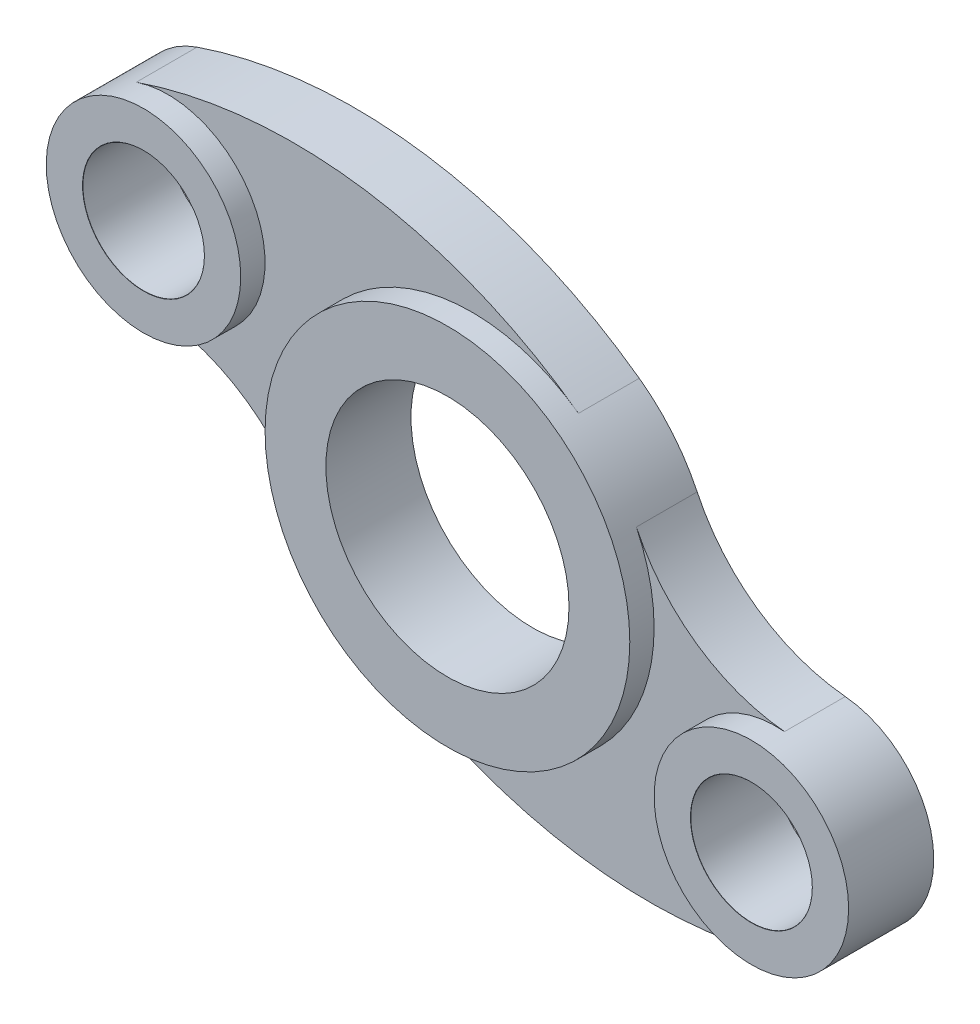
ISO-10303-21;
HEADER;
FILE_DESCRIPTION(('STEP AP214'),'2;1');
FILE_NAME('part.step','',(''),(''),'','','');
FILE_SCHEMA(('AUTOMOTIVE_DESIGN { 1 0 10303 214 1 1 1 1 }'));
ENDSEC;
DATA;
#1=APPLICATION_CONTEXT('core data for automotive mechanical design processes');
#2=APPLICATION_PROTOCOL_DEFINITION('international standard','automotive_design',2000,#1);
#3=PRODUCT_CONTEXT('',#1,'mechanical');
#4=PRODUCT('Part','Part','',(#3));
#5=PRODUCT_RELATED_PRODUCT_CATEGORY('part','',(#4));
#6=PRODUCT_DEFINITION_FORMATION('','',#4);
#7=PRODUCT_DEFINITION_CONTEXT('part definition',#1,'design');
#8=PRODUCT_DEFINITION('design','',#6,#7);
#9=PRODUCT_DEFINITION_SHAPE('','',#8);
#10=(LENGTH_UNIT() NAMED_UNIT(*) SI_UNIT(.MILLI.,.METRE.));
#11=(NAMED_UNIT(*) PLANE_ANGLE_UNIT() SI_UNIT($,.RADIAN.));
#12=(NAMED_UNIT(*) SI_UNIT($,.STERADIAN.) SOLID_ANGLE_UNIT());
#13=UNCERTAINTY_MEASURE_WITH_UNIT(LENGTH_MEASURE(1.E-05),#10,'distance_accuracy_value','');
#14=(GEOMETRIC_REPRESENTATION_CONTEXT(3) GLOBAL_UNCERTAINTY_ASSIGNED_CONTEXT((#13)) GLOBAL_UNIT_ASSIGNED_CONTEXT((#10,
#11,#12)) REPRESENTATION_CONTEXT('',''));
#15=CARTESIAN_POINT('',(0.,0.,0.));
#16=DIRECTION('',(0.,0.,1.));
#17=DIRECTION('',(1.,0.,0.));
#18=AXIS2_PLACEMENT_3D('',#15,#16,#17);
#19=CARTESIAN_POINT('',(-50.,20.,9.));
#20=DIRECTION('',(0.,0.,-1.));
#21=DIRECTION('',(-1.,0.,0.));
#22=AXIS2_PLACEMENT_3D('',#19,#20,#21);
#23=CYLINDRICAL_SURFACE('',#22,16.);
#24=CARTESIAN_POINT('',(-50.,20.,5.));
#25=DIRECTION('',(0.,0.,1.));
#26=DIRECTION('',(1.,0.,0.));
#27=AXIS2_PLACEMENT_3D('',#24,#25,#26);
#28=CIRCLE('',#27,16.);
#29=CARTESIAN_POINT('',(-51.4485016846459,4.06570231012431,5.));
#30=VERTEX_POINT('',#29);
#31=CARTESIAN_POINT('',(-55.1854307053229,35.1364232366929,5.));
#32=VERTEX_POINT('',#31);
#33=EDGE_CURVE('E60',#30,#32,#28,.T.);
#34=ORIENTED_EDGE('',*,*,#33,.T.);
#35=DIRECTION('',(0.,0.,-1.));
#36=VECTOR('',#35,1.);
#37=CARTESIAN_POINT('',(-55.1854307053229,35.1364232366928,5.));
#38=LINE('',#37,#36);
#39=CARTESIAN_POINT('',(-55.1854307053229,35.1364232366928,-5.));
#40=VERTEX_POINT('',#39);
#41=EDGE_CURVE('E195',#32,#40,#38,.T.);
#42=ORIENTED_EDGE('',*,*,#41,.T.);
#43=CARTESIAN_POINT('',(-50.,20.,-5.));
#44=DIRECTION('',(0.,0.,1.));
#45=DIRECTION('',(1.,0.,0.));
#46=AXIS2_PLACEMENT_3D('',#43,#44,#45);
#47=CIRCLE('',#46,16.);
#48=CARTESIAN_POINT('',(-51.4485016846459,4.06570231012431,-5.));
#49=VERTEX_POINT('',#48);
#50=EDGE_CURVE('E48',#40,#49,#47,.T.);
#51=ORIENTED_EDGE('',*,*,#50,.T.);
#52=DIRECTION('',(0.,0.,-1.));
#53=VECTOR('',#52,1.);
#54=CARTESIAN_POINT('',(-51.4485016846459,4.06570231012431,5.));
#55=LINE('',#54,#53);
#56=EDGE_CURVE('E65',#30,#49,#55,.T.);
#57=ORIENTED_EDGE('',*,*,#56,.F.);
#58=EDGE_LOOP('',(#34,#42,#51,#57));
#59=FACE_BOUND('',#58,.T.);
#60=CARTESIAN_POINT('',(-50.,20.,9.));
#61=DIRECTION('',(0.,0.,1.));
#62=DIRECTION('',(1.,0.,0.));
#63=AXIS2_PLACEMENT_3D('',#60,#61,#62);
#64=CIRCLE('',#63,16.);
#65=CARTESIAN_POINT('',(-34.,20.,9.));
#66=VERTEX_POINT('',#65);
#67=EDGE_CURVE('E11',#66,#66,#64,.T.);
#68=ORIENTED_EDGE('',*,*,#67,.F.);
#69=EDGE_LOOP('',(#68));
#70=FACE_BOUND('',#69,.T.);
#71=ADVANCED_FACE('F45',(#59,#70),#23,.T.);
#72=CARTESIAN_POINT('',(-50.,20.,9.));
#73=DIRECTION('',(0.,0.,1.));
#74=DIRECTION('',(1.,0.,0.));
#75=AXIS2_PLACEMENT_3D('',#72,#73,#74);
#76=PLANE('',#75);
#77=CARTESIAN_POINT('',(-50.,20.,9.));
#78=DIRECTION('',(0.,0.,1.));
#79=DIRECTION('',(1.,0.,0.));
#80=AXIS2_PLACEMENT_3D('',#77,#78,#79);
#81=CIRCLE('',#80,10.025);
#82=CARTESIAN_POINT('',(-39.975,20.,9.));
#83=VERTEX_POINT('',#82);
#84=EDGE_CURVE('E450',#83,#83,#81,.T.);
#85=ORIENTED_EDGE('',*,*,#84,.F.);
#86=EDGE_LOOP('',(#85));
#87=FACE_BOUND('',#86,.T.);
#88=ORIENTED_EDGE('',*,*,#67,.T.);
#89=EDGE_LOOP('',(#88));
#90=FACE_BOUND('',#89,.T.);
#91=ADVANCED_FACE('F238',(#87,#90),#76,.T.);
#92=CARTESIAN_POINT('',(-50.,20.,-5.));
#93=DIRECTION('',(0.,0.,1.));
#94=DIRECTION('',(1.,0.,0.));
#95=AXIS2_PLACEMENT_3D('',#92,#93,#94);
#96=PLANE('',#95);
#97=CARTESIAN_POINT('',(0.,0.,-5.));
#98=DIRECTION('',(0.,0.,1.));
#99=DIRECTION('',(1.,0.,0.));
#100=AXIS2_PLACEMENT_3D('',#97,#98,#99);
#101=CIRCLE('',#100,20.);
#102=CARTESIAN_POINT('',(20.,0.,-5.));
#103=VERTEX_POINT('',#102);
#104=EDGE_CURVE('E443',#103,#103,#101,.T.);
#105=ORIENTED_EDGE('',*,*,#104,.T.);
#106=EDGE_LOOP('',(#105));
#107=FACE_BOUND('',#106,.T.);
#108=CARTESIAN_POINT('',(-50.,20.,-5.));
#109=DIRECTION('',(0.,0.,1.));
#110=DIRECTION('',(1.,0.,0.));
#111=AXIS2_PLACEMENT_3D('',#108,#109,#110);
#112=CIRCLE('',#111,10.);
#113=CARTESIAN_POINT('',(-40.,20.,-5.));
#114=VERTEX_POINT('',#113);
#115=EDGE_CURVE('E460',#114,#114,#112,.T.);
#116=ORIENTED_EDGE('',*,*,#115,.T.);
#117=EDGE_LOOP('',(#116));
#118=FACE_BOUND('',#117,.T.);
#119=CARTESIAN_POINT('',(50.,-20.,-5.));
#120=DIRECTION('',(0.,0.,1.));
#121=DIRECTION('',(1.,0.,0.));
#122=AXIS2_PLACEMENT_3D('',#119,#120,#121);
#123=CIRCLE('',#122,10.);
#124=CARTESIAN_POINT('',(60.,-20.,-5.));
#125=VERTEX_POINT('',#124);
#126=EDGE_CURVE('E210',#125,#125,#123,.T.);
#127=ORIENTED_EDGE('',*,*,#126,.T.);
#128=EDGE_LOOP('',(#127));
#129=FACE_BOUND('',#128,.T.);
#130=ORIENTED_EDGE('',*,*,#50,.F.);
#131=CARTESIAN_POINT('',(-29.2582771787086,-40.5456929467713,-5.));
#132=DIRECTION('',(0.,0.,1.));
#133=DIRECTION('',(1.,0.,0.));
#134=AXIS2_PLACEMENT_3D('',#131,#132,#133);
#135=CIRCLE('',#134,80.);
#136=CARTESIAN_POINT('',(17.5549663072251,24.3274157680628,-5.));
#137=VERTEX_POINT('',#136);
#138=EDGE_CURVE('E164',#40,#137,#135,.F.);
#139=ORIENTED_EDGE('',*,*,#138,.T.);
#140=CARTESIAN_POINT('',(0.,0.,-5.));
#141=DIRECTION('',(0.,0.,1.));
#142=DIRECTION('',(1.,0.,0.));
#143=AXIS2_PLACEMENT_3D('',#140,#141,#142);
#144=CIRCLE('',#143,30.);
#145=CARTESIAN_POINT('',(27.0822211716785,12.9055529291963,-5.));
#146=VERTEX_POINT('',#145);
#147=EDGE_CURVE('E209',#146,#137,#144,.T.);
#148=ORIENTED_EDGE('',*,*,#147,.F.);
#149=CARTESIAN_POINT('',(54.164442343357,25.8111058583927,-5.));
#150=DIRECTION('',(0.,0.,1.));
#151=DIRECTION('',(1.,0.,0.));
#152=AXIS2_PLACEMENT_3D('',#149,#150,#151);
#153=CIRCLE('',#152,30.);
#154=CARTESIAN_POINT('',(51.4485016846459,-4.06570231012428,-5.));
#155=VERTEX_POINT('',#154);
#156=EDGE_CURVE('E117',#155,#146,#153,.F.);
#157=ORIENTED_EDGE('',*,*,#156,.F.);
#158=CARTESIAN_POINT('',(50.,-20.,-5.));
#159=DIRECTION('',(0.,0.,1.));
#160=DIRECTION('',(1.,0.,0.));
#161=AXIS2_PLACEMENT_3D('',#158,#159,#160);
#162=CIRCLE('',#161,16.);
#163=CARTESIAN_POINT('',(55.1854307053229,-35.1364232366928,-5.));
#164=VERTEX_POINT('',#163);
#165=EDGE_CURVE('E159',#164,#155,#162,.T.);
#166=ORIENTED_EDGE('',*,*,#165,.F.);
#167=CARTESIAN_POINT('',(29.2582771787085,40.5456929467714,-5.));
#168=DIRECTION('',(0.,0.,1.));
#169=DIRECTION('',(1.,0.,0.));
#170=AXIS2_PLACEMENT_3D('',#167,#168,#169);
#171=CIRCLE('',#170,80.);
#172=CARTESIAN_POINT('',(-17.5549663072251,-24.3274157680628,-5.));
#173=VERTEX_POINT('',#172);
#174=EDGE_CURVE('E145',#164,#173,#171,.F.);
#175=ORIENTED_EDGE('',*,*,#174,.T.);
#176=CARTESIAN_POINT('',(-27.0822211716785,-12.9055529291963,-5.));
#177=VERTEX_POINT('',#176);
#178=EDGE_CURVE('E206',#177,#173,#144,.T.);
#179=ORIENTED_EDGE('',*,*,#178,.F.);
#180=CARTESIAN_POINT('',(-54.164442343357,-25.8111058583926,-5.));
#181=DIRECTION('',(0.,0.,1.));
#182=DIRECTION('',(1.,0.,0.));
#183=AXIS2_PLACEMENT_3D('',#180,#181,#182);
#184=CIRCLE('',#183,30.);
#185=EDGE_CURVE('E170',#49,#177,#184,.F.);
#186=ORIENTED_EDGE('',*,*,#185,.F.);
#187=EDGE_LOOP('',(#130,#139,#148,#157,#166,#175,#179,#186));
#188=FACE_BOUND('',#187,.T.);
#189=ADVANCED_FACE('F205',(#107,#118,#129,#188),#96,.F.);
#190=CARTESIAN_POINT('',(-29.2582771787086,-40.5456929467713,5.));
#191=DIRECTION('',(0.,0.,-1.));
#192=DIRECTION('',(-1.,0.,0.));
#193=AXIS2_PLACEMENT_3D('',#190,#191,#192);
#194=CYLINDRICAL_SURFACE('',#193,80.);
#195=ORIENTED_EDGE('',*,*,#138,.F.);
#196=ORIENTED_EDGE('',*,*,#41,.F.);
#197=CARTESIAN_POINT('',(-29.2582771787086,-40.5456929467713,5.));
#198=DIRECTION('',(0.,0.,1.));
#199=DIRECTION('',(1.,0.,0.));
#200=AXIS2_PLACEMENT_3D('',#197,#198,#199);
#201=CIRCLE('',#200,80.);
#202=CARTESIAN_POINT('',(17.5549663072251,24.3274157680628,5.));
#203=VERTEX_POINT('',#202);
#204=EDGE_CURVE('E167',#32,#203,#201,.F.);
#205=ORIENTED_EDGE('',*,*,#204,.T.);
#206=DIRECTION('',(0.,0.,-1.));
#207=VECTOR('',#206,1.);
#208=CARTESIAN_POINT('',(17.5549663072251,24.3274157680628,5.));
#209=LINE('',#208,#207);
#210=EDGE_CURVE('E181',#203,#137,#209,.T.);
#211=ORIENTED_EDGE('',*,*,#210,.T.);
#212=EDGE_LOOP('',(#195,#196,#205,#211));
#213=FACE_BOUND('',#212,.T.);
#214=ADVANCED_FACE('F247',(#213),#194,.T.);
#215=CARTESIAN_POINT('',(-54.164442343357,-25.8111058583926,5.));
#216=DIRECTION('',(0.,0.,-1.));
#217=DIRECTION('',(-1.,0.,0.));
#218=AXIS2_PLACEMENT_3D('',#215,#216,#217);
#219=CYLINDRICAL_SURFACE('',#218,30.);
#220=ORIENTED_EDGE('',*,*,#185,.T.);
#221=DIRECTION('',(0.,0.,-1.));
#222=VECTOR('',#221,1.);
#223=CARTESIAN_POINT('',(-27.0822211716785,-12.9055529291963,5.));
#224=LINE('',#223,#222);
#225=CARTESIAN_POINT('',(-27.0822211716785,-12.9055529291963,5.));
#226=VERTEX_POINT('',#225);
#227=EDGE_CURVE('E189',#226,#177,#224,.T.);
#228=ORIENTED_EDGE('',*,*,#227,.F.);
#229=CARTESIAN_POINT('',(-54.164442343357,-25.8111058583926,5.));
#230=DIRECTION('',(0.,0.,1.));
#231=DIRECTION('',(1.,0.,0.));
#232=AXIS2_PLACEMENT_3D('',#229,#230,#231);
#233=CIRCLE('',#232,30.);
#234=EDGE_CURVE('E173',#30,#226,#233,.F.);
#235=ORIENTED_EDGE('',*,*,#234,.F.);
#236=ORIENTED_EDGE('',*,*,#56,.T.);
#237=EDGE_LOOP('',(#220,#228,#235,#236));
#238=FACE_BOUND('',#237,.T.);
#239=ADVANCED_FACE('F203',(#238),#219,.F.);
#240=CARTESIAN_POINT('',(0.,0.,5.));
#241=DIRECTION('',(0.,0.,1.));
#242=DIRECTION('',(1.,0.,0.));
#243=AXIS2_PLACEMENT_3D('',#240,#241,#242);
#244=PLANE('',#243);
#245=ORIENTED_EDGE('',*,*,#204,.F.);
#246=ORIENTED_EDGE('',*,*,#33,.F.);
#247=ORIENTED_EDGE('',*,*,#234,.T.);
#248=CARTESIAN_POINT('',(0.,0.,5.));
#249=DIRECTION('',(0.,0.,1.));
#250=DIRECTION('',(1.,0.,0.));
#251=AXIS2_PLACEMENT_3D('',#248,#249,#250);
#252=CIRCLE('',#251,30.);
#253=EDGE_CURVE('E177',#203,#226,#252,.T.);
#254=ORIENTED_EDGE('',*,*,#253,.F.);
#255=EDGE_LOOP('',(#245,#246,#247,#254));
#256=FACE_BOUND('',#255,.T.);
#257=ADVANCED_FACE('F257',(#256),#244,.T.);
#258=CARTESIAN_POINT('',(50.,-20.,9.));
#259=DIRECTION('',(0.,0.,-1.));
#260=DIRECTION('',(-1.,0.,0.));
#261=AXIS2_PLACEMENT_3D('',#258,#259,#260);
#262=CYLINDRICAL_SURFACE('',#261,16.);
#263=CARTESIAN_POINT('',(50.,-20.,5.));
#264=DIRECTION('',(0.,0.,1.));
#265=DIRECTION('',(1.,0.,0.));
#266=AXIS2_PLACEMENT_3D('',#263,#264,#265);
#267=CIRCLE('',#266,16.);
#268=CARTESIAN_POINT('',(51.4485016846459,-4.06570231012429,5.));
#269=VERTEX_POINT('',#268);
#270=CARTESIAN_POINT('',(55.1854307053229,-35.1364232366928,5.));
#271=VERTEX_POINT('',#270);
#272=EDGE_CURVE('E132',#269,#271,#267,.T.);
#273=ORIENTED_EDGE('',*,*,#272,.T.);
#274=DIRECTION('',(0.,0.,-1.));
#275=VECTOR('',#274,1.);
#276=CARTESIAN_POINT('',(55.1854307053229,-35.1364232366928,5.));
#277=LINE('',#276,#275);
#278=EDGE_CURVE('E155',#271,#164,#277,.T.);
#279=ORIENTED_EDGE('',*,*,#278,.T.);
#280=ORIENTED_EDGE('',*,*,#165,.T.);
#281=DIRECTION('',(0.,0.,-1.));
#282=VECTOR('',#281,1.);
#283=CARTESIAN_POINT('',(51.4485016846459,-4.06570231012428,5.));
#284=LINE('',#283,#282);
#285=EDGE_CURVE('E123',#269,#155,#284,.T.);
#286=ORIENTED_EDGE('',*,*,#285,.F.);
#287=EDGE_LOOP('',(#273,#279,#280,#286));
#288=FACE_BOUND('',#287,.T.);
#289=CARTESIAN_POINT('',(50.,-20.,9.));
#290=DIRECTION('',(0.,0.,1.));
#291=DIRECTION('',(1.,0.,0.));
#292=AXIS2_PLACEMENT_3D('',#289,#290,#291);
#293=CIRCLE('',#292,16.);
#294=CARTESIAN_POINT('',(66.,-20.,9.));
#295=VERTEX_POINT('',#294);
#296=EDGE_CURVE('E160',#295,#295,#293,.T.);
#297=ORIENTED_EDGE('',*,*,#296,.F.);
#298=EDGE_LOOP('',(#297));
#299=FACE_BOUND('',#298,.T.);
#300=ADVANCED_FACE('F223',(#288,#299),#262,.T.);
#301=CARTESIAN_POINT('',(50.,-20.,9.));
#302=DIRECTION('',(0.,0.,1.));
#303=DIRECTION('',(1.,0.,0.));
#304=AXIS2_PLACEMENT_3D('',#301,#302,#303);
#305=PLANE('',#304);
#306=CARTESIAN_POINT('',(50.,-20.,9.00000000000001));
#307=DIRECTION('',(0.,0.,1.));
#308=DIRECTION('',(1.,0.,0.));
#309=AXIS2_PLACEMENT_3D('',#306,#307,#308);
#310=CIRCLE('',#309,10.025);
#311=CARTESIAN_POINT('',(60.025,-20.,9.00000000000001));
#312=VERTEX_POINT('',#311);
#313=EDGE_CURVE('E464',#312,#312,#310,.T.);
#314=ORIENTED_EDGE('',*,*,#313,.F.);
#315=EDGE_LOOP('',(#314));
#316=FACE_BOUND('',#315,.T.);
#317=ORIENTED_EDGE('',*,*,#296,.T.);
#318=EDGE_LOOP('',(#317));
#319=FACE_BOUND('',#318,.T.);
#320=ADVANCED_FACE('F228',(#316,#319),#305,.T.);
#321=CARTESIAN_POINT('',(29.2582771787085,40.5456929467714,5.));
#322=DIRECTION('',(0.,0.,-1.));
#323=DIRECTION('',(-1.,0.,0.));
#324=AXIS2_PLACEMENT_3D('',#321,#322,#323);
#325=CYLINDRICAL_SURFACE('',#324,80.);
#326=ORIENTED_EDGE('',*,*,#174,.F.);
#327=ORIENTED_EDGE('',*,*,#278,.F.);
#328=CARTESIAN_POINT('',(29.2582771787085,40.5456929467714,5.));
#329=DIRECTION('',(0.,0.,1.));
#330=DIRECTION('',(1.,0.,0.));
#331=AXIS2_PLACEMENT_3D('',#328,#329,#330);
#332=CIRCLE('',#331,80.);
#333=CARTESIAN_POINT('',(-17.5549663072251,-24.3274157680628,5.));
#334=VERTEX_POINT('',#333);
#335=EDGE_CURVE('E151',#271,#334,#332,.F.);
#336=ORIENTED_EDGE('',*,*,#335,.T.);
#337=DIRECTION('',(0.,0.,-1.));
#338=VECTOR('',#337,1.);
#339=CARTESIAN_POINT('',(-17.5549663072251,-24.3274157680628,5.));
#340=LINE('',#339,#338);
#341=EDGE_CURVE('E124',#334,#173,#340,.T.);
#342=ORIENTED_EDGE('',*,*,#341,.T.);
#343=EDGE_LOOP('',(#326,#327,#336,#342));
#344=FACE_BOUND('',#343,.T.);
#345=ADVANCED_FACE('F226',(#344),#325,.T.);
#346=CARTESIAN_POINT('',(54.164442343357,25.8111058583927,5.));
#347=DIRECTION('',(0.,0.,-1.));
#348=DIRECTION('',(-1.,0.,0.));
#349=AXIS2_PLACEMENT_3D('',#346,#347,#348);
#350=CYLINDRICAL_SURFACE('',#349,30.);
#351=ORIENTED_EDGE('',*,*,#156,.T.);
#352=DIRECTION('',(0.,0.,-1.));
#353=VECTOR('',#352,1.);
#354=CARTESIAN_POINT('',(27.0822211716785,12.9055529291963,5.));
#355=LINE('',#354,#353);
#356=CARTESIAN_POINT('',(27.0822211716785,12.9055529291963,5.));
#357=VERTEX_POINT('',#356);
#358=EDGE_CURVE('E110',#357,#146,#355,.T.);
#359=ORIENTED_EDGE('',*,*,#358,.F.);
#360=CARTESIAN_POINT('',(54.164442343357,25.8111058583927,5.));
#361=DIRECTION('',(0.,0.,1.));
#362=DIRECTION('',(1.,0.,0.));
#363=AXIS2_PLACEMENT_3D('',#360,#361,#362);
#364=CIRCLE('',#363,30.);
#365=EDGE_CURVE('E114',#269,#357,#364,.F.);
#366=ORIENTED_EDGE('',*,*,#365,.F.);
#367=ORIENTED_EDGE('',*,*,#285,.T.);
#368=EDGE_LOOP('',(#351,#359,#366,#367));
#369=FACE_BOUND('',#368,.T.);
#370=ADVANCED_FACE('F112',(#369),#350,.F.);
#371=CARTESIAN_POINT('',(0.,0.,5.));
#372=DIRECTION('',(0.,0.,1.));
#373=DIRECTION('',(1.,0.,0.));
#374=AXIS2_PLACEMENT_3D('',#371,#372,#373);
#375=PLANE('',#374);
#376=ORIENTED_EDGE('',*,*,#335,.F.);
#377=ORIENTED_EDGE('',*,*,#272,.F.);
#378=ORIENTED_EDGE('',*,*,#365,.T.);
#379=CARTESIAN_POINT('',(0.,0.,5.));
#380=DIRECTION('',(0.,0.,1.));
#381=DIRECTION('',(1.,0.,0.));
#382=AXIS2_PLACEMENT_3D('',#379,#380,#381);
#383=CIRCLE('',#382,30.);
#384=EDGE_CURVE('E130',#334,#357,#383,.T.);
#385=ORIENTED_EDGE('',*,*,#384,.F.);
#386=EDGE_LOOP('',(#376,#377,#378,#385));
#387=FACE_BOUND('',#386,.T.);
#388=ADVANCED_FACE('F129',(#387),#375,.T.);
#389=CARTESIAN_POINT('',(0.,0.,9.));
#390=DIRECTION('',(0.,0.,-1.));
#391=DIRECTION('',(-1.,0.,0.));
#392=AXIS2_PLACEMENT_3D('',#389,#390,#391);
#393=CYLINDRICAL_SURFACE('',#392,30.);
#394=ORIENTED_EDGE('',*,*,#210,.F.);
#395=ORIENTED_EDGE('',*,*,#253,.T.);
#396=ORIENTED_EDGE('',*,*,#227,.T.);
#397=ORIENTED_EDGE('',*,*,#178,.T.);
#398=ORIENTED_EDGE('',*,*,#341,.F.);
#399=ORIENTED_EDGE('',*,*,#384,.T.);
#400=ORIENTED_EDGE('',*,*,#358,.T.);
#401=ORIENTED_EDGE('',*,*,#147,.T.);
#402=EDGE_LOOP('',(#394,#395,#396,#397,#398,#399,#400,#401));
#403=FACE_BOUND('',#402,.T.);
#404=CARTESIAN_POINT('',(0.,0.,9.));
#405=DIRECTION('',(0.,0.,1.));
#406=DIRECTION('',(1.,0.,0.));
#407=AXIS2_PLACEMENT_3D('',#404,#405,#406);
#408=CIRCLE('',#407,30.);
#409=CARTESIAN_POINT('',(30.,0.,9.));
#410=VERTEX_POINT('',#409);
#411=EDGE_CURVE('E149',#410,#410,#408,.T.);
#412=ORIENTED_EDGE('',*,*,#411,.F.);
#413=EDGE_LOOP('',(#412));
#414=FACE_BOUND('',#413,.T.);
#415=ADVANCED_FACE('F136',(#403,#414),#393,.T.);
#416=CARTESIAN_POINT('',(0.,0.,9.));
#417=DIRECTION('',(0.,0.,1.));
#418=DIRECTION('',(1.,0.,0.));
#419=AXIS2_PLACEMENT_3D('',#416,#417,#418);
#420=PLANE('',#419);
#421=CARTESIAN_POINT('',(0.,0.,9.));
#422=DIRECTION('',(0.,0.,1.));
#423=DIRECTION('',(1.,0.,0.));
#424=AXIS2_PLACEMENT_3D('',#421,#422,#423);
#425=CIRCLE('',#424,20.);
#426=CARTESIAN_POINT('',(20.,0.,9.));
#427=VERTEX_POINT('',#426);
#428=EDGE_CURVE('E446',#427,#427,#425,.T.);
#429=ORIENTED_EDGE('',*,*,#428,.F.);
#430=EDGE_LOOP('',(#429));
#431=FACE_BOUND('',#430,.T.);
#432=ORIENTED_EDGE('',*,*,#411,.T.);
#433=EDGE_LOOP('',(#432));
#434=FACE_BOUND('',#433,.T.);
#435=ADVANCED_FACE('F285',(#431,#434),#420,.T.);
#436=CARTESIAN_POINT('',(50.,-20.,9.00000000000001));
#437=DIRECTION('',(0.,0.,1.));
#438=DIRECTION('',(1.,0.,0.));
#439=AXIS2_PLACEMENT_3D('',#436,#437,#438);
#440=CYLINDRICAL_SURFACE('',#439,10.);
#441=ORIENTED_EDGE('',*,*,#126,.F.);
#442=EDGE_LOOP('',(#441));
#443=FACE_BOUND('',#442,.T.);
#444=CARTESIAN_POINT('',(50.,-20.,8.975));
#445=DIRECTION('',(0.,0.,1.));
#446=DIRECTION('',(1.,0.,0.));
#447=AXIS2_PLACEMENT_3D('',#444,#445,#446);
#448=CIRCLE('',#447,10.);
#449=CARTESIAN_POINT('',(60.,-20.,8.975));
#450=VERTEX_POINT('',#449);
#451=EDGE_CURVE('E215',#450,#450,#448,.T.);
#452=ORIENTED_EDGE('',*,*,#451,.T.);
#453=EDGE_LOOP('',(#452));
#454=FACE_BOUND('',#453,.T.);
#455=ADVANCED_FACE('F279',(#443,#454),#440,.F.);
#456=CARTESIAN_POINT('',(50.,-20.,9.00000000000001));
#457=DIRECTION('',(0.,0.,1.));
#458=DIRECTION('',(1.,0.,0.));
#459=AXIS2_PLACEMENT_3D('',#456,#457,#458);
#460=CONICAL_SURFACE('',#459,10.025,0.785398163397414);
#461=ORIENTED_EDGE('',*,*,#451,.F.);
#462=EDGE_LOOP('',(#461));
#463=FACE_BOUND('',#462,.T.);
#464=ORIENTED_EDGE('',*,*,#313,.T.);
#465=EDGE_LOOP('',(#464));
#466=FACE_BOUND('',#465,.T.);
#467=ADVANCED_FACE('F284',(#463,#466),#460,.F.);
#468=CARTESIAN_POINT('',(-50.,20.,9.));
#469=DIRECTION('',(0.,0.,1.));
#470=DIRECTION('',(1.,0.,0.));
#471=AXIS2_PLACEMENT_3D('',#468,#469,#470);
#472=CYLINDRICAL_SURFACE('',#471,10.);
#473=ORIENTED_EDGE('',*,*,#115,.F.);
#474=EDGE_LOOP('',(#473));
#475=FACE_BOUND('',#474,.T.);
#476=CARTESIAN_POINT('',(-50.,20.,8.975));
#477=DIRECTION('',(0.,0.,1.));
#478=DIRECTION('',(1.,0.,0.));
#479=AXIS2_PLACEMENT_3D('',#476,#477,#478);
#480=CIRCLE('',#479,10.);
#481=CARTESIAN_POINT('',(-40.,20.,8.975));
#482=VERTEX_POINT('',#481);
#483=EDGE_CURVE('E456',#482,#482,#480,.T.);
#484=ORIENTED_EDGE('',*,*,#483,.T.);
#485=EDGE_LOOP('',(#484));
#486=FACE_BOUND('',#485,.T.);
#487=ADVANCED_FACE('F298',(#475,#486),#472,.F.);
#488=CARTESIAN_POINT('',(-50.,20.,9.));
#489=DIRECTION('',(0.,0.,1.));
#490=DIRECTION('',(1.,0.,0.));
#491=AXIS2_PLACEMENT_3D('',#488,#489,#490);
#492=CONICAL_SURFACE('',#491,10.025,0.785398163397414);
#493=ORIENTED_EDGE('',*,*,#483,.F.);
#494=EDGE_LOOP('',(#493));
#495=FACE_BOUND('',#494,.T.);
#496=ORIENTED_EDGE('',*,*,#84,.T.);
#497=EDGE_LOOP('',(#496));
#498=FACE_BOUND('',#497,.T.);
#499=ADVANCED_FACE('F309',(#495,#498),#492,.F.);
#500=CARTESIAN_POINT('',(0.,0.,-5.));
#501=DIRECTION('',(0.,0.,1.));
#502=DIRECTION('',(1.,0.,0.));
#503=AXIS2_PLACEMENT_3D('',#500,#501,#502);
#504=CYLINDRICAL_SURFACE('',#503,20.);
#505=ORIENTED_EDGE('',*,*,#104,.F.);
#506=EDGE_LOOP('',(#505));
#507=FACE_BOUND('',#506,.T.);
#508=ORIENTED_EDGE('',*,*,#428,.T.);
#509=EDGE_LOOP('',(#508));
#510=FACE_BOUND('',#509,.T.);
#511=ADVANCED_FACE('F320',(#507,#510),#504,.F.);
#512=CLOSED_SHELL('',(#71,#91,#189,#214,#239,#257,#300,#320,#345,#370,#388,#415,#435,#455,#467,
#487,#499,#511));
#513=MANIFOLD_SOLID_BREP('B2',#512);
#514=ADVANCED_BREP_SHAPE_REPRESENTATION('',(#18,#513),#14);
#515=SHAPE_DEFINITION_REPRESENTATION(#9,#514);
ENDSEC;
END-ISO-10303-21;
